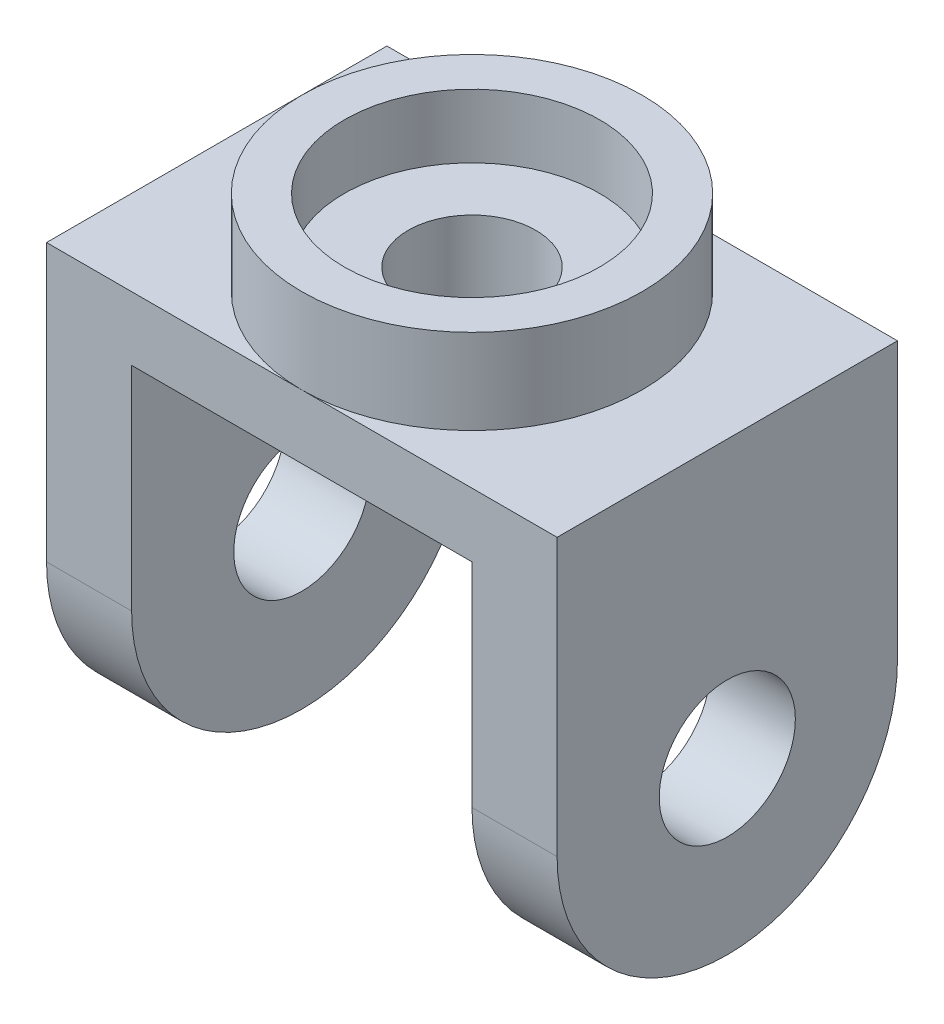
ISO-10303-21;
HEADER;
FILE_DESCRIPTION(('STEP AP214'),'2;1');
FILE_NAME('part.step','',(''),(''),'','','');
FILE_SCHEMA(('AUTOMOTIVE_DESIGN { 1 0 10303 214 1 1 1 1 }'));
ENDSEC;
DATA;
#1=APPLICATION_CONTEXT('core data for automotive mechanical design processes');
#2=APPLICATION_PROTOCOL_DEFINITION('international standard','automotive_design',2000,#1);
#3=PRODUCT_CONTEXT('',#1,'mechanical');
#4=PRODUCT('Part','Part','',(#3));
#5=PRODUCT_RELATED_PRODUCT_CATEGORY('part','',(#4));
#6=PRODUCT_DEFINITION_FORMATION('','',#4);
#7=PRODUCT_DEFINITION_CONTEXT('part definition',#1,'design');
#8=PRODUCT_DEFINITION('design','',#6,#7);
#9=PRODUCT_DEFINITION_SHAPE('','',#8);
#10=(LENGTH_UNIT() NAMED_UNIT(*) SI_UNIT(.MILLI.,.METRE.));
#11=(NAMED_UNIT(*) PLANE_ANGLE_UNIT() SI_UNIT($,.RADIAN.));
#12=(NAMED_UNIT(*) SI_UNIT($,.STERADIAN.) SOLID_ANGLE_UNIT());
#13=UNCERTAINTY_MEASURE_WITH_UNIT(LENGTH_MEASURE(1.E-05),#10,'distance_accuracy_value','');
#14=(GEOMETRIC_REPRESENTATION_CONTEXT(3) GLOBAL_UNCERTAINTY_ASSIGNED_CONTEXT((#13)) GLOBAL_UNIT_ASSIGNED_CONTEXT((#10,
#11,#12)) REPRESENTATION_CONTEXT('',''));
#15=CARTESIAN_POINT('',(0.,0.,0.));
#16=DIRECTION('',(0.,0.,1.));
#17=DIRECTION('',(1.,0.,0.));
#18=AXIS2_PLACEMENT_3D('',#15,#16,#17);
#19=CARTESIAN_POINT('',(0.,0.,0.));
#20=DIRECTION('',(0.,-1.,0.));
#21=DIRECTION('',(0.,0.,-1.));
#22=AXIS2_PLACEMENT_3D('',#19,#20,#21);
#23=PLANE('',#22);
#24=CARTESIAN_POINT('',(0.,0.,0.));
#25=DIRECTION('',(0.,1.,0.));
#26=DIRECTION('',(0.,0.,1.));
#27=AXIS2_PLACEMENT_3D('',#24,#25,#26);
#28=CIRCLE('',#27,15.);
#29=CARTESIAN_POINT('',(0.,0.,15.));
#30=VERTEX_POINT('',#29);
#31=EDGE_CURVE('E194',#30,#30,#28,.T.);
#32=ORIENTED_EDGE('',*,*,#31,.T.);
#33=EDGE_LOOP('',(#32));
#34=FACE_BOUND('',#33,.T.);
#35=DIRECTION('',(1.,0.,0.));
#36=VECTOR('',#35,1.);
#37=CARTESIAN_POINT('',(-60.,0.,40.));
#38=LINE('',#37,#36);
#39=CARTESIAN_POINT('',(-40.,0.,40.));
#40=VERTEX_POINT('',#39);
#41=CARTESIAN_POINT('',(40.,0.,40.));
#42=VERTEX_POINT('',#41);
#43=EDGE_CURVE('E68',#40,#42,#38,.T.);
#44=ORIENTED_EDGE('',*,*,#43,.F.);
#45=DIRECTION('',(0.,0.,1.));
#46=VECTOR('',#45,1.);
#47=CARTESIAN_POINT('',(-40.,0.,-40.));
#48=LINE('',#47,#46);
#49=CARTESIAN_POINT('',(-40.,0.,-40.));
#50=VERTEX_POINT('',#49);
#51=EDGE_CURVE('E124',#50,#40,#48,.T.);
#52=ORIENTED_EDGE('',*,*,#51,.F.);
#53=DIRECTION('',(-1.,0.,0.));
#54=VECTOR('',#53,1.);
#55=CARTESIAN_POINT('',(-60.,0.,-40.));
#56=LINE('',#55,#54);
#57=CARTESIAN_POINT('',(40.,0.,-40.));
#58=VERTEX_POINT('',#57);
#59=EDGE_CURVE('E212',#58,#50,#56,.T.);
#60=ORIENTED_EDGE('',*,*,#59,.F.);
#61=DIRECTION('',(0.,0.,1.));
#62=VECTOR('',#61,1.);
#63=CARTESIAN_POINT('',(40.,0.,-40.));
#64=LINE('',#63,#62);
#65=EDGE_CURVE('E175',#58,#42,#64,.T.);
#66=ORIENTED_EDGE('',*,*,#65,.T.);
#67=EDGE_LOOP('',(#44,#52,#60,#66));
#68=FACE_BOUND('',#67,.T.);
#69=ADVANCED_FACE('F45',(#34,#68),#23,.T.);
#70=CARTESIAN_POINT('',(0.,15.,0.));
#71=DIRECTION('',(0.,-1.,0.));
#72=DIRECTION('',(0.,0.,-1.));
#73=AXIS2_PLACEMENT_3D('',#70,#71,#72);
#74=PLANE('',#73);
#75=CARTESIAN_POINT('',(0.,15.,0.));
#76=DIRECTION('',(0.,1.,0.));
#77=DIRECTION('',(0.,0.,1.));
#78=AXIS2_PLACEMENT_3D('',#75,#76,#77);
#79=CIRCLE('',#78,40.);
#80=CARTESIAN_POINT('',(0.,15.,40.));
#81=VERTEX_POINT('',#80);
#82=CARTESIAN_POINT('',(0.,15.,-40.));
#83=VERTEX_POINT('',#82);
#84=EDGE_CURVE('E56',#81,#83,#79,.T.);
#85=ORIENTED_EDGE('',*,*,#84,.F.);
#86=DIRECTION('',(1.,0.,0.));
#87=VECTOR('',#86,1.);
#88=CARTESIAN_POINT('',(-60.,15.,40.));
#89=LINE('',#88,#87);
#90=CARTESIAN_POINT('',(60.,15.,40.));
#91=VERTEX_POINT('',#90);
#92=EDGE_CURVE('E228',#81,#91,#89,.T.);
#93=ORIENTED_EDGE('',*,*,#92,.T.);
#94=DIRECTION('',(0.,0.,-1.));
#95=VECTOR('',#94,1.);
#96=CARTESIAN_POINT('',(60.,15.,40.));
#97=LINE('',#96,#95);
#98=CARTESIAN_POINT('',(60.,15.,-40.));
#99=VERTEX_POINT('',#98);
#100=EDGE_CURVE('E216',#91,#99,#97,.T.);
#101=ORIENTED_EDGE('',*,*,#100,.T.);
#102=DIRECTION('',(-1.,0.,0.));
#103=VECTOR('',#102,1.);
#104=CARTESIAN_POINT('',(-60.,15.,-40.));
#105=LINE('',#104,#103);
#106=EDGE_CURVE('E221',#99,#83,#105,.T.);
#107=ORIENTED_EDGE('',*,*,#106,.T.);
#108=EDGE_LOOP('',(#85,#93,#101,#107));
#109=FACE_BOUND('',#108,.T.);
#110=ADVANCED_FACE('F266',(#109),#74,.F.);
#111=CARTESIAN_POINT('',(60.,15.,40.));
#112=DIRECTION('',(-1.,0.,0.));
#113=DIRECTION('',(0.,0.,1.));
#114=AXIS2_PLACEMENT_3D('',#111,#112,#113);
#115=PLANE('',#114);
#116=DIRECTION('',(0.,-1.,0.));
#117=VECTOR('',#116,1.);
#118=CARTESIAN_POINT('',(60.,15.,40.));
#119=LINE('',#118,#117);
#120=CARTESIAN_POINT('',(60.,-50.,40.));
#121=VERTEX_POINT('',#120);
#122=EDGE_CURVE('E232',#91,#121,#119,.T.);
#123=ORIENTED_EDGE('',*,*,#122,.T.);
#124=CARTESIAN_POINT('',(60.,-50.,0.));
#125=DIRECTION('',(1.,0.,0.));
#126=DIRECTION('',(0.,0.,-1.));
#127=AXIS2_PLACEMENT_3D('',#124,#125,#126);
#128=CIRCLE('',#127,40.);
#129=CARTESIAN_POINT('',(60.,-50.,-40.));
#130=VERTEX_POINT('',#129);
#131=EDGE_CURVE('E163',#121,#130,#128,.T.);
#132=ORIENTED_EDGE('',*,*,#131,.T.);
#133=DIRECTION('',(0.,-1.,0.));
#134=VECTOR('',#133,1.);
#135=CARTESIAN_POINT('',(60.,15.,-40.));
#136=LINE('',#135,#134);
#137=EDGE_CURVE('E49',#99,#130,#136,.T.);
#138=ORIENTED_EDGE('',*,*,#137,.F.);
#139=ORIENTED_EDGE('',*,*,#100,.F.);
#140=EDGE_LOOP('',(#123,#132,#138,#139));
#141=FACE_BOUND('',#140,.T.);
#142=CARTESIAN_POINT('',(60.,-50.,0.));
#143=DIRECTION('',(1.,0.,0.));
#144=DIRECTION('',(0.,0.,-1.));
#145=AXIS2_PLACEMENT_3D('',#142,#143,#144);
#146=CIRCLE('',#145,16.);
#147=CARTESIAN_POINT('',(60.,-50.,-16.));
#148=VERTEX_POINT('',#147);
#149=EDGE_CURVE('E157',#148,#148,#146,.T.);
#150=ORIENTED_EDGE('',*,*,#149,.F.);
#151=EDGE_LOOP('',(#150));
#152=FACE_BOUND('',#151,.T.);
#153=ADVANCED_FACE('F47',(#141,#152),#115,.F.);
#154=CARTESIAN_POINT('',(-60.,15.,-40.));
#155=DIRECTION('',(0.,0.,1.));
#156=DIRECTION('',(1.,0.,0.));
#157=AXIS2_PLACEMENT_3D('',#154,#155,#156);
#158=PLANE('',#157);
#159=ORIENTED_EDGE('',*,*,#137,.T.);
#160=DIRECTION('',(1.,0.,0.));
#161=VECTOR('',#160,1.);
#162=CARTESIAN_POINT('',(40.,-50.,-40.));
#163=LINE('',#162,#161);
#164=CARTESIAN_POINT('',(40.,-50.,-40.));
#165=VERTEX_POINT('',#164);
#166=EDGE_CURVE('E182',#165,#130,#163,.T.);
#167=ORIENTED_EDGE('',*,*,#166,.F.);
#168=DIRECTION('',(0.,1.,0.));
#169=VECTOR('',#168,1.);
#170=CARTESIAN_POINT('',(40.,-50.,-40.));
#171=LINE('',#170,#169);
#172=EDGE_CURVE('E171',#165,#58,#171,.T.);
#173=ORIENTED_EDGE('',*,*,#172,.T.);
#174=ORIENTED_EDGE('',*,*,#59,.T.);
#175=DIRECTION('',(0.,1.,0.));
#176=VECTOR('',#175,1.);
#177=CARTESIAN_POINT('',(-40.,-50.,-40.));
#178=LINE('',#177,#176);
#179=CARTESIAN_POINT('',(-40.,-50.,-40.));
#180=VERTEX_POINT('',#179);
#181=EDGE_CURVE('E138',#180,#50,#178,.T.);
#182=ORIENTED_EDGE('',*,*,#181,.F.);
#183=DIRECTION('',(-1.,0.,0.));
#184=VECTOR('',#183,1.);
#185=CARTESIAN_POINT('',(-40.,-50.,-40.));
#186=LINE('',#185,#184);
#187=CARTESIAN_POINT('',(-60.,-50.,-40.));
#188=VERTEX_POINT('',#187);
#189=EDGE_CURVE('E137',#180,#188,#186,.T.);
#190=ORIENTED_EDGE('',*,*,#189,.T.);
#191=DIRECTION('',(0.,-1.,0.));
#192=VECTOR('',#191,1.);
#193=CARTESIAN_POINT('',(-60.,15.,-40.));
#194=LINE('',#193,#192);
#195=CARTESIAN_POINT('',(-60.,15.,-40.));
#196=VERTEX_POINT('',#195);
#197=EDGE_CURVE('E241',#196,#188,#194,.T.);
#198=ORIENTED_EDGE('',*,*,#197,.F.);
#199=EDGE_CURVE('E220',#83,#196,#105,.T.);
#200=ORIENTED_EDGE('',*,*,#199,.F.);
#201=ORIENTED_EDGE('',*,*,#106,.F.);
#202=EDGE_LOOP('',(#159,#167,#173,#174,#182,#190,#198,#200,#201));
#203=FACE_BOUND('',#202,.T.);
#204=ADVANCED_FACE('F249',(#203),#158,.F.);
#205=CARTESIAN_POINT('',(-60.,15.,40.));
#206=DIRECTION('',(1.,0.,0.));
#207=DIRECTION('',(0.,0.,-1.));
#208=AXIS2_PLACEMENT_3D('',#205,#206,#207);
#209=PLANE('',#208);
#210=ORIENTED_EDGE('',*,*,#197,.T.);
#211=CARTESIAN_POINT('',(-60.,-50.,0.));
#212=DIRECTION('',(1.,0.,0.));
#213=DIRECTION('',(0.,0.,-1.));
#214=AXIS2_PLACEMENT_3D('',#211,#212,#213);
#215=CIRCLE('',#214,40.);
#216=CARTESIAN_POINT('',(-60.,-50.,40.));
#217=VERTEX_POINT('',#216);
#218=EDGE_CURVE('E143',#217,#188,#215,.T.);
#219=ORIENTED_EDGE('',*,*,#218,.F.);
#220=DIRECTION('',(0.,-1.,0.));
#221=VECTOR('',#220,1.);
#222=CARTESIAN_POINT('',(-60.,15.,40.));
#223=LINE('',#222,#221);
#224=CARTESIAN_POINT('',(-60.,15.,40.));
#225=VERTEX_POINT('',#224);
#226=EDGE_CURVE('E132',#225,#217,#223,.T.);
#227=ORIENTED_EDGE('',*,*,#226,.F.);
#228=DIRECTION('',(0.,0.,1.));
#229=VECTOR('',#228,1.);
#230=CARTESIAN_POINT('',(-60.,15.,40.));
#231=LINE('',#230,#229);
#232=EDGE_CURVE('E225',#196,#225,#231,.T.);
#233=ORIENTED_EDGE('',*,*,#232,.F.);
#234=EDGE_LOOP('',(#210,#219,#227,#233));
#235=FACE_BOUND('',#234,.T.);
#236=CARTESIAN_POINT('',(-60.,-50.,0.));
#237=DIRECTION('',(1.,0.,0.));
#238=DIRECTION('',(0.,0.,-1.));
#239=AXIS2_PLACEMENT_3D('',#236,#237,#238);
#240=CIRCLE('',#239,16.);
#241=CARTESIAN_POINT('',(-60.,-50.,-16.));
#242=VERTEX_POINT('',#241);
#243=EDGE_CURVE('E149',#242,#242,#240,.T.);
#244=ORIENTED_EDGE('',*,*,#243,.T.);
#245=EDGE_LOOP('',(#244));
#246=FACE_BOUND('',#245,.T.);
#247=ADVANCED_FACE('F281',(#235,#246),#209,.F.);
#248=CARTESIAN_POINT('',(-60.,15.,40.));
#249=DIRECTION('',(0.,0.,-1.));
#250=DIRECTION('',(-1.,0.,0.));
#251=AXIS2_PLACEMENT_3D('',#248,#249,#250);
#252=PLANE('',#251);
#253=ORIENTED_EDGE('',*,*,#226,.T.);
#254=DIRECTION('',(-1.,0.,0.));
#255=VECTOR('',#254,1.);
#256=CARTESIAN_POINT('',(-40.,-50.,40.));
#257=LINE('',#256,#255);
#258=CARTESIAN_POINT('',(-40.,-50.,40.));
#259=VERTEX_POINT('',#258);
#260=EDGE_CURVE('E128',#259,#217,#257,.T.);
#261=ORIENTED_EDGE('',*,*,#260,.F.);
#262=DIRECTION('',(0.,-1.,0.));
#263=VECTOR('',#262,1.);
#264=CARTESIAN_POINT('',(-40.,-50.,40.));
#265=LINE('',#264,#263);
#266=EDGE_CURVE('E63',#40,#259,#265,.T.);
#267=ORIENTED_EDGE('',*,*,#266,.F.);
#268=ORIENTED_EDGE('',*,*,#43,.T.);
#269=DIRECTION('',(0.,-1.,0.));
#270=VECTOR('',#269,1.);
#271=CARTESIAN_POINT('',(40.,-50.,40.));
#272=LINE('',#271,#270);
#273=CARTESIAN_POINT('',(40.,-50.,40.));
#274=VERTEX_POINT('',#273);
#275=EDGE_CURVE('E179',#42,#274,#272,.T.);
#276=ORIENTED_EDGE('',*,*,#275,.T.);
#277=DIRECTION('',(1.,0.,0.));
#278=VECTOR('',#277,1.);
#279=CARTESIAN_POINT('',(40.,-50.,40.));
#280=LINE('',#279,#278);
#281=EDGE_CURVE('E186',#274,#121,#280,.T.);
#282=ORIENTED_EDGE('',*,*,#281,.T.);
#283=ORIENTED_EDGE('',*,*,#122,.F.);
#284=ORIENTED_EDGE('',*,*,#92,.F.);
#285=EDGE_CURVE('E229',#225,#81,#89,.T.);
#286=ORIENTED_EDGE('',*,*,#285,.F.);
#287=EDGE_LOOP('',(#253,#261,#267,#268,#276,#282,#283,#284,#286));
#288=FACE_BOUND('',#287,.T.);
#289=ADVANCED_FACE('F129',(#288),#252,.F.);
#290=EDGE_CURVE('E11',#83,#81,#79,.T.);
#291=ORIENTED_EDGE('',*,*,#290,.F.);
#292=ORIENTED_EDGE('',*,*,#199,.T.);
#293=ORIENTED_EDGE('',*,*,#232,.T.);
#294=ORIENTED_EDGE('',*,*,#285,.T.);
#295=EDGE_LOOP('',(#291,#292,#293,#294));
#296=FACE_BOUND('',#295,.T.);
#297=ADVANCED_FACE('F276',(#296),#74,.F.);
#298=CARTESIAN_POINT('',(0.,35.,0.));
#299=DIRECTION('',(0.,-1.,0.));
#300=DIRECTION('',(0.,0.,-1.));
#301=AXIS2_PLACEMENT_3D('',#298,#299,#300);
#302=CYLINDRICAL_SURFACE('',#301,40.);
#303=CARTESIAN_POINT('',(0.,35.,0.));
#304=DIRECTION('',(0.,1.,0.));
#305=DIRECTION('',(0.,0.,1.));
#306=AXIS2_PLACEMENT_3D('',#303,#304,#305);
#307=CIRCLE('',#306,40.);
#308=CARTESIAN_POINT('',(0.,35.,40.));
#309=VERTEX_POINT('',#308);
#310=EDGE_CURVE('E209',#309,#309,#307,.T.);
#311=ORIENTED_EDGE('',*,*,#310,.F.);
#312=EDGE_LOOP('',(#311));
#313=FACE_BOUND('',#312,.T.);
#314=ORIENTED_EDGE('',*,*,#84,.T.);
#315=ORIENTED_EDGE('',*,*,#290,.T.);
#316=EDGE_LOOP('',(#314,#315));
#317=FACE_BOUND('',#316,.T.);
#318=ADVANCED_FACE('F386',(#313,#317),#302,.T.);
#319=CARTESIAN_POINT('',(0.,35.,0.));
#320=DIRECTION('',(0.,1.,0.));
#321=DIRECTION('',(0.,0.,1.));
#322=AXIS2_PLACEMENT_3D('',#319,#320,#321);
#323=PLANE('',#322);
#324=CARTESIAN_POINT('',(0.,35.,0.));
#325=DIRECTION('',(0.,1.,0.));
#326=DIRECTION('',(0.,0.,1.));
#327=AXIS2_PLACEMENT_3D('',#324,#325,#326);
#328=CIRCLE('',#327,30.);
#329=CARTESIAN_POINT('',(0.,35.,30.));
#330=VERTEX_POINT('',#329);
#331=EDGE_CURVE('E198',#330,#330,#328,.T.);
#332=ORIENTED_EDGE('',*,*,#331,.F.);
#333=EDGE_LOOP('',(#332));
#334=FACE_BOUND('',#333,.T.);
#335=ORIENTED_EDGE('',*,*,#310,.T.);
#336=EDGE_LOOP('',(#335));
#337=FACE_BOUND('',#336,.T.);
#338=ADVANCED_FACE('F383',(#334,#337),#323,.T.);
#339=CARTESIAN_POINT('',(0.,20.,0.));
#340=DIRECTION('',(0.,1.,0.));
#341=DIRECTION('',(0.,0.,1.));
#342=AXIS2_PLACEMENT_3D('',#339,#340,#341);
#343=CYLINDRICAL_SURFACE('',#342,30.);
#344=CARTESIAN_POINT('',(0.,20.,0.));
#345=DIRECTION('',(0.,1.,0.));
#346=DIRECTION('',(0.,0.,1.));
#347=AXIS2_PLACEMENT_3D('',#344,#345,#346);
#348=CIRCLE('',#347,30.);
#349=CARTESIAN_POINT('',(0.,20.,30.));
#350=VERTEX_POINT('',#349);
#351=EDGE_CURVE('E202',#350,#350,#348,.T.);
#352=ORIENTED_EDGE('',*,*,#351,.F.);
#353=EDGE_LOOP('',(#352));
#354=FACE_BOUND('',#353,.T.);
#355=ORIENTED_EDGE('',*,*,#331,.T.);
#356=EDGE_LOOP('',(#355));
#357=FACE_BOUND('',#356,.T.);
#358=ADVANCED_FACE('F379',(#354,#357),#343,.F.);
#359=CARTESIAN_POINT('',(0.,20.,0.));
#360=DIRECTION('',(0.,1.,0.));
#361=DIRECTION('',(0.,0.,1.));
#362=AXIS2_PLACEMENT_3D('',#359,#360,#361);
#363=PLANE('',#362);
#364=CARTESIAN_POINT('',(0.,20.,0.));
#365=DIRECTION('',(0.,1.,0.));
#366=DIRECTION('',(0.,0.,1.));
#367=AXIS2_PLACEMENT_3D('',#364,#365,#366);
#368=CIRCLE('',#367,15.);
#369=CARTESIAN_POINT('',(0.,20.,15.));
#370=VERTEX_POINT('',#369);
#371=EDGE_CURVE('E190',#370,#370,#368,.T.);
#372=ORIENTED_EDGE('',*,*,#371,.F.);
#373=EDGE_LOOP('',(#372));
#374=FACE_BOUND('',#373,.T.);
#375=ORIENTED_EDGE('',*,*,#351,.T.);
#376=EDGE_LOOP('',(#375));
#377=FACE_BOUND('',#376,.T.);
#378=ADVANCED_FACE('F376',(#374,#377),#363,.T.);
#379=CARTESIAN_POINT('',(0.,0.,0.));
#380=DIRECTION('',(0.,1.,0.));
#381=DIRECTION('',(0.,0.,1.));
#382=AXIS2_PLACEMENT_3D('',#379,#380,#381);
#383=CYLINDRICAL_SURFACE('',#382,15.);
#384=ORIENTED_EDGE('',*,*,#31,.F.);
#385=EDGE_LOOP('',(#384));
#386=FACE_BOUND('',#385,.T.);
#387=ORIENTED_EDGE('',*,*,#371,.T.);
#388=EDGE_LOOP('',(#387));
#389=FACE_BOUND('',#388,.T.);
#390=ADVANCED_FACE('F295',(#386,#389),#383,.F.);
#391=CARTESIAN_POINT('',(40.,-50.,0.));
#392=DIRECTION('',(1.,0.,0.));
#393=DIRECTION('',(0.,0.,-1.));
#394=AXIS2_PLACEMENT_3D('',#391,#392,#393);
#395=CYLINDRICAL_SURFACE('',#394,40.);
#396=ORIENTED_EDGE('',*,*,#131,.F.);
#397=ORIENTED_EDGE('',*,*,#281,.F.);
#398=CARTESIAN_POINT('',(40.,-50.,0.));
#399=DIRECTION('',(1.,0.,0.));
#400=DIRECTION('',(0.,0.,-1.));
#401=AXIS2_PLACEMENT_3D('',#398,#399,#400);
#402=CIRCLE('',#401,40.);
#403=EDGE_CURVE('E167',#274,#165,#402,.T.);
#404=ORIENTED_EDGE('',*,*,#403,.T.);
#405=ORIENTED_EDGE('',*,*,#166,.T.);
#406=EDGE_LOOP('',(#396,#397,#404,#405));
#407=FACE_BOUND('',#406,.T.);
#408=ADVANCED_FACE('F256',(#407),#395,.T.);
#409=CARTESIAN_POINT('',(40.,-50.,0.));
#410=DIRECTION('',(1.,0.,0.));
#411=DIRECTION('',(0.,0.,-1.));
#412=AXIS2_PLACEMENT_3D('',#409,#410,#411);
#413=PLANE('',#412);
#414=CARTESIAN_POINT('',(40.,-50.,0.));
#415=DIRECTION('',(1.,0.,0.));
#416=DIRECTION('',(0.,0.,-1.));
#417=AXIS2_PLACEMENT_3D('',#414,#415,#416);
#418=CIRCLE('',#417,16.);
#419=CARTESIAN_POINT('',(40.,-50.,-16.));
#420=VERTEX_POINT('',#419);
#421=EDGE_CURVE('E159',#420,#420,#418,.T.);
#422=ORIENTED_EDGE('',*,*,#421,.T.);
#423=EDGE_LOOP('',(#422));
#424=FACE_BOUND('',#423,.T.);
#425=ORIENTED_EDGE('',*,*,#403,.F.);
#426=ORIENTED_EDGE('',*,*,#275,.F.);
#427=ORIENTED_EDGE('',*,*,#65,.F.);
#428=ORIENTED_EDGE('',*,*,#172,.F.);
#429=EDGE_LOOP('',(#425,#426,#427,#428));
#430=FACE_BOUND('',#429,.T.);
#431=ADVANCED_FACE('F262',(#424,#430),#413,.F.);
#432=CARTESIAN_POINT('',(40.,-50.,0.));
#433=DIRECTION('',(1.,0.,0.));
#434=DIRECTION('',(0.,0.,-1.));
#435=AXIS2_PLACEMENT_3D('',#432,#433,#434);
#436=CYLINDRICAL_SURFACE('',#435,16.);
#437=ORIENTED_EDGE('',*,*,#421,.F.);
#438=EDGE_LOOP('',(#437));
#439=FACE_BOUND('',#438,.T.);
#440=ORIENTED_EDGE('',*,*,#149,.T.);
#441=EDGE_LOOP('',(#440));
#442=FACE_BOUND('',#441,.T.);
#443=ADVANCED_FACE('F308',(#439,#442),#436,.F.);
#444=CARTESIAN_POINT('',(-40.,-50.,0.));
#445=DIRECTION('',(-1.,0.,0.));
#446=DIRECTION('',(0.,0.,-1.));
#447=AXIS2_PLACEMENT_3D('',#444,#445,#446);
#448=PLANE('',#447);
#449=CARTESIAN_POINT('',(-40.,-50.,0.));
#450=DIRECTION('',(1.,0.,0.));
#451=DIRECTION('',(0.,0.,-1.));
#452=AXIS2_PLACEMENT_3D('',#449,#450,#451);
#453=CIRCLE('',#452,40.);
#454=EDGE_CURVE('E121',#259,#180,#453,.T.);
#455=ORIENTED_EDGE('',*,*,#454,.T.);
#456=ORIENTED_EDGE('',*,*,#181,.T.);
#457=ORIENTED_EDGE('',*,*,#51,.T.);
#458=ORIENTED_EDGE('',*,*,#266,.T.);
#459=EDGE_LOOP('',(#455,#456,#457,#458));
#460=FACE_BOUND('',#459,.T.);
#461=CARTESIAN_POINT('',(-40.,-50.,0.));
#462=DIRECTION('',(1.,0.,0.));
#463=DIRECTION('',(0.,0.,-1.));
#464=AXIS2_PLACEMENT_3D('',#461,#462,#463);
#465=CIRCLE('',#464,16.);
#466=CARTESIAN_POINT('',(-40.,-50.,-16.));
#467=VERTEX_POINT('',#466);
#468=EDGE_CURVE('E146',#467,#467,#465,.T.);
#469=ORIENTED_EDGE('',*,*,#468,.F.);
#470=EDGE_LOOP('',(#469));
#471=FACE_BOUND('',#470,.T.);
#472=ADVANCED_FACE('F118',(#460,#471),#448,.F.);
#473=CARTESIAN_POINT('',(-40.,-50.,0.));
#474=DIRECTION('',(-1.,0.,0.));
#475=DIRECTION('',(0.,0.,1.));
#476=AXIS2_PLACEMENT_3D('',#473,#474,#475);
#477=CYLINDRICAL_SURFACE('',#476,40.);
#478=ORIENTED_EDGE('',*,*,#218,.T.);
#479=ORIENTED_EDGE('',*,*,#189,.F.);
#480=ORIENTED_EDGE('',*,*,#454,.F.);
#481=ORIENTED_EDGE('',*,*,#260,.T.);
#482=EDGE_LOOP('',(#478,#479,#480,#481));
#483=FACE_BOUND('',#482,.T.);
#484=ADVANCED_FACE('F140',(#483),#477,.T.);
#485=CARTESIAN_POINT('',(-40.,-50.,0.));
#486=DIRECTION('',(-1.,0.,0.));
#487=DIRECTION('',(0.,0.,1.));
#488=AXIS2_PLACEMENT_3D('',#485,#486,#487);
#489=CYLINDRICAL_SURFACE('',#488,16.);
#490=ORIENTED_EDGE('',*,*,#468,.T.);
#491=EDGE_LOOP('',(#490));
#492=FACE_BOUND('',#491,.T.);
#493=ORIENTED_EDGE('',*,*,#243,.F.);
#494=EDGE_LOOP('',(#493));
#495=FACE_BOUND('',#494,.T.);
#496=ADVANCED_FACE('F360',(#492,#495),#489,.F.);
#497=CLOSED_SHELL('',(#69,#110,#153,#204,#247,#289,#297,#318,#338,#358,#378,#390,#408,#431,#443,
#472,#484,#496));
#498=MANIFOLD_SOLID_BREP('B2',#497);
#499=ADVANCED_BREP_SHAPE_REPRESENTATION('',(#18,#498),#14);
#500=SHAPE_DEFINITION_REPRESENTATION(#9,#499);
ENDSEC;
END-ISO-10303-21;
